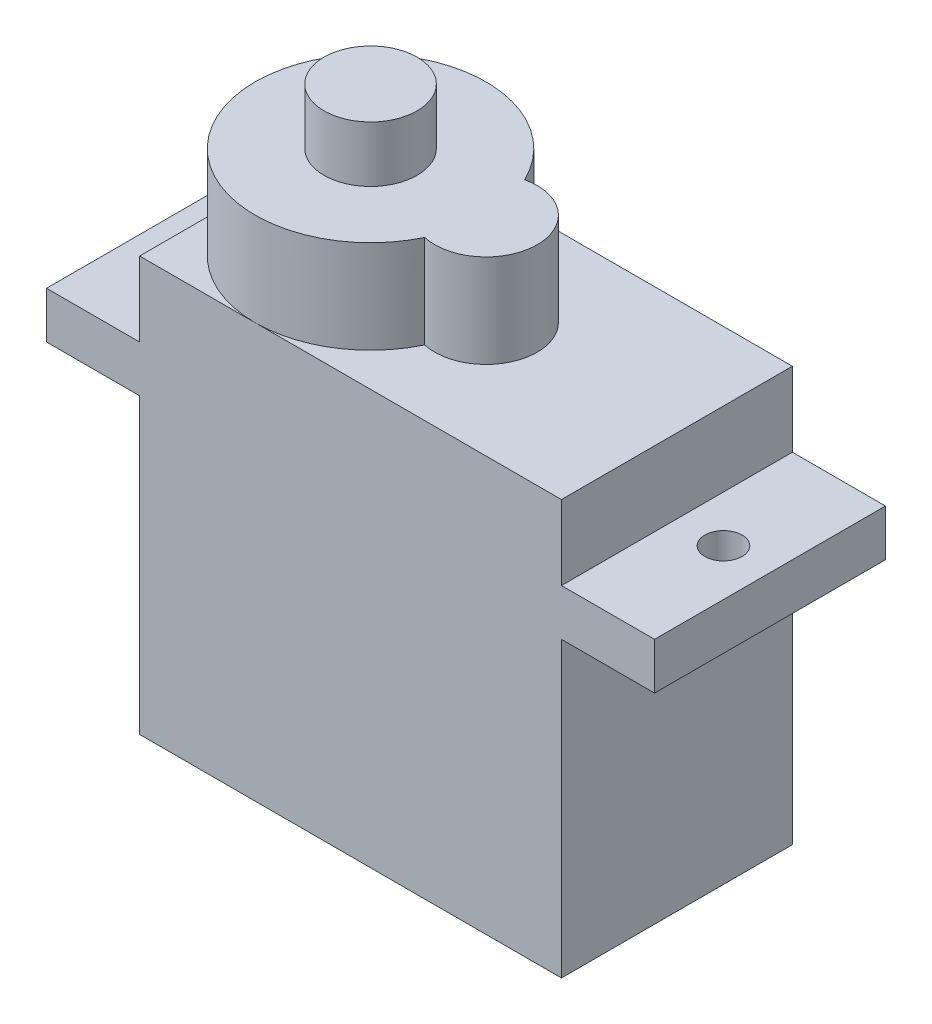
ISO-10303-21;
HEADER;
FILE_DESCRIPTION(('STEP AP214'),'2;1');
FILE_NAME('part.step','',(''),(''),'','','');
FILE_SCHEMA(('AUTOMOTIVE_DESIGN { 1 0 10303 214 1 1 1 1 }'));
ENDSEC;
DATA;
#1=APPLICATION_CONTEXT('core data for automotive mechanical design processes');
#2=APPLICATION_PROTOCOL_DEFINITION('international standard','automotive_design',2000,#1);
#3=PRODUCT_CONTEXT('',#1,'mechanical');
#4=PRODUCT('Part','Part','',(#3));
#5=PRODUCT_RELATED_PRODUCT_CATEGORY('part','',(#4));
#6=PRODUCT_DEFINITION_FORMATION('','',#4);
#7=PRODUCT_DEFINITION_CONTEXT('part definition',#1,'design');
#8=PRODUCT_DEFINITION('design','',#6,#7);
#9=PRODUCT_DEFINITION_SHAPE('','',#8);
#10=(LENGTH_UNIT() NAMED_UNIT(*) SI_UNIT(.MILLI.,.METRE.));
#11=(NAMED_UNIT(*) PLANE_ANGLE_UNIT() SI_UNIT($,.RADIAN.));
#12=(NAMED_UNIT(*) SI_UNIT($,.STERADIAN.) SOLID_ANGLE_UNIT());
#13=UNCERTAINTY_MEASURE_WITH_UNIT(LENGTH_MEASURE(1.E-05),#10,'distance_accuracy_value','');
#14=(GEOMETRIC_REPRESENTATION_CONTEXT(3) GLOBAL_UNCERTAINTY_ASSIGNED_CONTEXT((#13)) GLOBAL_UNIT_ASSIGNED_CONTEXT((#10,
#11,#12)) REPRESENTATION_CONTEXT('',''));
#15=CARTESIAN_POINT('',(0.,0.,0.));
#16=DIRECTION('',(0.,0.,1.));
#17=DIRECTION('',(1.,0.,0.));
#18=AXIS2_PLACEMENT_3D('',#15,#16,#17);
#19=CARTESIAN_POINT('',(-22.65,0.,12.4));
#20=DIRECTION('',(1.,0.,0.));
#21=DIRECTION('',(0.,0.,-1.));
#22=AXIS2_PLACEMENT_3D('',#19,#20,#21);
#23=PLANE('',#22);
#24=DIRECTION('',(0.,-1.,0.));
#25=VECTOR('',#24,1.);
#26=CARTESIAN_POINT('',(-22.65,0.,0.));
#27=LINE('',#26,#25);
#28=CARTESIAN_POINT('',(-22.65,15.75,0.));
#29=VERTEX_POINT('',#28);
#30=CARTESIAN_POINT('',(-22.65,0.,0.));
#31=VERTEX_POINT('',#30);
#32=EDGE_CURVE('E270',#29,#31,#27,.T.);
#33=ORIENTED_EDGE('',*,*,#32,.T.);
#34=DIRECTION('',(0.,0.,-1.));
#35=VECTOR('',#34,1.);
#36=CARTESIAN_POINT('',(-22.65,0.,12.4));
#37=LINE('',#36,#35);
#38=CARTESIAN_POINT('',(-22.65,0.,12.4));
#39=VERTEX_POINT('',#38);
#40=EDGE_CURVE('E275',#39,#31,#37,.T.);
#41=ORIENTED_EDGE('',*,*,#40,.F.);
#42=DIRECTION('',(0.,-1.,0.));
#43=VECTOR('',#42,1.);
#44=CARTESIAN_POINT('',(-22.65,0.,12.4));
#45=LINE('',#44,#43);
#46=CARTESIAN_POINT('',(-22.65,15.75,12.4));
#47=VERTEX_POINT('',#46);
#48=EDGE_CURVE('E243',#47,#39,#45,.T.);
#49=ORIENTED_EDGE('',*,*,#48,.F.);
#50=DIRECTION('',(0.,0.,-1.));
#51=VECTOR('',#50,1.);
#52=CARTESIAN_POINT('',(-22.65,15.75,12.4));
#53=LINE('',#52,#51);
#54=EDGE_CURVE('E278',#47,#29,#53,.T.);
#55=ORIENTED_EDGE('',*,*,#54,.T.);
#56=EDGE_LOOP('',(#33,#41,#49,#55));
#57=FACE_BOUND('',#56,.T.);
#58=DIRECTION('',(0.,-1.,0.));
#59=VECTOR('',#58,1.);
#60=CARTESIAN_POINT('',(-22.65,5.5,4.2));
#61=LINE('',#60,#59);
#62=CARTESIAN_POINT('',(-22.65,5.5,4.2));
#63=VERTEX_POINT('',#62);
#64=CARTESIAN_POINT('',(-22.65,4.5,4.2));
#65=VERTEX_POINT('',#64);
#66=EDGE_CURVE('E190',#63,#65,#61,.T.);
#67=ORIENTED_EDGE('',*,*,#66,.F.);
#68=DIRECTION('',(0.,0.,-1.));
#69=VECTOR('',#68,1.);
#70=CARTESIAN_POINT('',(-22.65,5.5,4.2));
#71=LINE('',#70,#69);
#72=CARTESIAN_POINT('',(-22.65,5.5,8.2));
#73=VERTEX_POINT('',#72);
#74=EDGE_CURVE('E187',#73,#63,#71,.T.);
#75=ORIENTED_EDGE('',*,*,#74,.F.);
#76=DIRECTION('',(0.,1.,0.));
#77=VECTOR('',#76,1.);
#78=CARTESIAN_POINT('',(-22.65,5.5,8.2));
#79=LINE('',#78,#77);
#80=CARTESIAN_POINT('',(-22.65,4.5,8.2));
#81=VERTEX_POINT('',#80);
#82=EDGE_CURVE('E56',#81,#73,#79,.T.);
#83=ORIENTED_EDGE('',*,*,#82,.F.);
#84=DIRECTION('',(0.,0.,1.));
#85=VECTOR('',#84,1.);
#86=CARTESIAN_POINT('',(-22.65,4.5,4.2));
#87=LINE('',#86,#85);
#88=EDGE_CURVE('E51',#65,#81,#87,.T.);
#89=ORIENTED_EDGE('',*,*,#88,.F.);
#90=EDGE_LOOP('',(#67,#75,#83,#89));
#91=FACE_BOUND('',#90,.T.);
#92=ADVANCED_FACE('F33',(#57,#91),#23,.F.);
#93=CARTESIAN_POINT('',(0.,22.25,12.4));
#94=DIRECTION('',(0.,-1.,0.));
#95=DIRECTION('',(1.,0.,0.));
#96=AXIS2_PLACEMENT_3D('',#93,#94,#95);
#97=PLANE('',#96);
#98=CARTESIAN_POINT('',(-10.25,22.25,6.2));
#99=DIRECTION('',(0.,1.,0.));
#100=DIRECTION('',(-1.,0.,0.));
#101=AXIS2_PLACEMENT_3D('',#98,#99,#100);
#102=CIRCLE('',#101,2.75);
#103=CARTESIAN_POINT('',(-10.8598790322581,22.25,8.88151963744664));
#104=VERTEX_POINT('',#103);
#105=CARTESIAN_POINT('',(-10.8598790322581,22.25,3.51848036255336));
#106=VERTEX_POINT('',#105);
#107=EDGE_CURVE('E201',#104,#106,#102,.T.);
#108=ORIENTED_EDGE('',*,*,#107,.F.);
#109=CARTESIAN_POINT('',(-16.45,22.25,6.2));
#110=DIRECTION('',(0.,1.,0.));
#111=DIRECTION('',(-1.,0.,0.));
#112=AXIS2_PLACEMENT_3D('',#109,#110,#111);
#113=CIRCLE('',#112,6.2);
#114=CARTESIAN_POINT('',(-16.45,22.25,12.4));
#115=VERTEX_POINT('',#114);
#116=EDGE_CURVE('E212',#115,#104,#113,.T.);
#117=ORIENTED_EDGE('',*,*,#116,.F.);
#118=DIRECTION('',(-1.,0.,0.));
#119=VECTOR('',#118,1.);
#120=CARTESIAN_POINT('',(0.,22.25,12.4));
#121=LINE('',#120,#119);
#122=CARTESIAN_POINT('',(0.,22.25,12.4));
#123=VERTEX_POINT('',#122);
#124=EDGE_CURVE('E232',#123,#115,#121,.T.);
#125=ORIENTED_EDGE('',*,*,#124,.F.);
#126=DIRECTION('',(0.,0.,-1.));
#127=VECTOR('',#126,1.);
#128=CARTESIAN_POINT('',(0.,22.25,12.4));
#129=LINE('',#128,#127);
#130=CARTESIAN_POINT('',(0.,22.25,0.));
#131=VERTEX_POINT('',#130);
#132=EDGE_CURVE('E294',#123,#131,#129,.T.);
#133=ORIENTED_EDGE('',*,*,#132,.T.);
#134=DIRECTION('',(-1.,0.,0.));
#135=VECTOR('',#134,1.);
#136=CARTESIAN_POINT('',(0.,22.25,0.));
#137=LINE('',#136,#135);
#138=CARTESIAN_POINT('',(-16.45,22.25,0.));
#139=VERTEX_POINT('',#138);
#140=EDGE_CURVE('E259',#131,#139,#137,.T.);
#141=ORIENTED_EDGE('',*,*,#140,.T.);
#142=EDGE_CURVE('E44',#106,#139,#113,.T.);
#143=ORIENTED_EDGE('',*,*,#142,.F.);
#144=EDGE_LOOP('',(#108,#117,#125,#133,#141,#143));
#145=FACE_BOUND('',#144,.T.);
#146=ADVANCED_FACE('F338',(#145),#97,.F.);
#147=CARTESIAN_POINT('',(-22.65,22.25,6.2));
#148=VERTEX_POINT('',#147);
#149=EDGE_CURVE('E11',#139,#148,#113,.T.);
#150=ORIENTED_EDGE('',*,*,#149,.F.);
#151=CARTESIAN_POINT('',(-22.65,22.25,0.));
#152=VERTEX_POINT('',#151);
#153=EDGE_CURVE('E258',#139,#152,#137,.T.);
#154=ORIENTED_EDGE('',*,*,#153,.T.);
#155=DIRECTION('',(0.,0.,-1.));
#156=VECTOR('',#155,1.);
#157=CARTESIAN_POINT('',(-22.65,22.25,12.4));
#158=LINE('',#157,#156);
#159=EDGE_CURVE('E290',#148,#152,#158,.T.);
#160=ORIENTED_EDGE('',*,*,#159,.F.);
#161=EDGE_LOOP('',(#150,#154,#160));
#162=FACE_BOUND('',#161,.T.);
#163=ADVANCED_FACE('F324',(#162),#97,.F.);
#164=CARTESIAN_POINT('',(0.,0.,12.4));
#165=DIRECTION('',(-1.,0.,0.));
#166=DIRECTION('',(0.,0.,1.));
#167=AXIS2_PLACEMENT_3D('',#164,#165,#166);
#168=PLANE('',#167);
#169=DIRECTION('',(0.,1.,0.));
#170=VECTOR('',#169,1.);
#171=CARTESIAN_POINT('',(0.,0.,0.));
#172=LINE('',#171,#170);
#173=CARTESIAN_POINT('',(0.,0.,0.));
#174=VERTEX_POINT('',#173);
#175=CARTESIAN_POINT('',(0.,15.75,0.));
#176=VERTEX_POINT('',#175);
#177=EDGE_CURVE('E218',#174,#176,#172,.T.);
#178=ORIENTED_EDGE('',*,*,#177,.T.);
#179=DIRECTION('',(0.,0.,-1.));
#180=VECTOR('',#179,1.);
#181=CARTESIAN_POINT('',(0.,15.75,12.4));
#182=LINE('',#181,#180);
#183=CARTESIAN_POINT('',(0.,15.75,12.4));
#184=VERTEX_POINT('',#183);
#185=EDGE_CURVE('E37',#184,#176,#182,.T.);
#186=ORIENTED_EDGE('',*,*,#185,.F.);
#187=DIRECTION('',(0.,1.,0.));
#188=VECTOR('',#187,1.);
#189=CARTESIAN_POINT('',(0.,0.,12.4));
#190=LINE('',#189,#188);
#191=CARTESIAN_POINT('',(0.,0.,12.4));
#192=VERTEX_POINT('',#191);
#193=EDGE_CURVE('E219',#192,#184,#190,.T.);
#194=ORIENTED_EDGE('',*,*,#193,.F.);
#195=DIRECTION('',(0.,0.,-1.));
#196=VECTOR('',#195,1.);
#197=CARTESIAN_POINT('',(0.,0.,12.4));
#198=LINE('',#197,#196);
#199=EDGE_CURVE('E247',#192,#174,#198,.T.);
#200=ORIENTED_EDGE('',*,*,#199,.T.);
#201=EDGE_LOOP('',(#178,#186,#194,#200));
#202=FACE_BOUND('',#201,.T.);
#203=ADVANCED_FACE('F35',(#202),#168,.F.);
#204=CARTESIAN_POINT('',(0.,15.75,12.4));
#205=DIRECTION('',(0.,1.,0.));
#206=DIRECTION('',(0.,0.,1.));
#207=AXIS2_PLACEMENT_3D('',#204,#205,#206);
#208=PLANE('',#207);
#209=CARTESIAN_POINT('',(2.5,15.75,6.2));
#210=DIRECTION('',(0.,1.,0.));
#211=DIRECTION('',(0.,0.,1.));
#212=AXIS2_PLACEMENT_3D('',#209,#210,#211);
#213=CIRCLE('',#212,1.);
#214=CARTESIAN_POINT('',(2.5,15.75,7.2));
#215=VERTEX_POINT('',#214);
#216=EDGE_CURVE('E404',#215,#215,#213,.T.);
#217=ORIENTED_EDGE('',*,*,#216,.T.);
#218=EDGE_LOOP('',(#217));
#219=FACE_BOUND('',#218,.T.);
#220=DIRECTION('',(1.,0.,0.));
#221=VECTOR('',#220,1.);
#222=CARTESIAN_POINT('',(0.,15.75,0.));
#223=LINE('',#222,#221);
#224=CARTESIAN_POINT('',(5.,15.75,0.));
#225=VERTEX_POINT('',#224);
#226=EDGE_CURVE('E250',#176,#225,#223,.T.);
#227=ORIENTED_EDGE('',*,*,#226,.T.);
#228=DIRECTION('',(0.,0.,-1.));
#229=VECTOR('',#228,1.);
#230=CARTESIAN_POINT('',(5.,15.75,12.4));
#231=LINE('',#230,#229);
#232=CARTESIAN_POINT('',(5.,15.75,12.4));
#233=VERTEX_POINT('',#232);
#234=EDGE_CURVE('E302',#233,#225,#231,.T.);
#235=ORIENTED_EDGE('',*,*,#234,.F.);
#236=DIRECTION('',(1.,0.,0.));
#237=VECTOR('',#236,1.);
#238=CARTESIAN_POINT('',(0.,15.75,12.4));
#239=LINE('',#238,#237);
#240=EDGE_CURVE('E222',#184,#233,#239,.T.);
#241=ORIENTED_EDGE('',*,*,#240,.F.);
#242=ORIENTED_EDGE('',*,*,#185,.T.);
#243=EDGE_LOOP('',(#227,#235,#241,#242));
#244=FACE_BOUND('',#243,.T.);
#245=ADVANCED_FACE('F395',(#219,#244),#208,.F.);
#246=CARTESIAN_POINT('',(5.,18.25,12.4));
#247=DIRECTION('',(-1.,0.,0.));
#248=DIRECTION('',(0.,0.,1.));
#249=AXIS2_PLACEMENT_3D('',#246,#247,#248);
#250=PLANE('',#249);
#251=DIRECTION('',(0.,1.,0.));
#252=VECTOR('',#251,1.);
#253=CARTESIAN_POINT('',(5.,18.25,0.));
#254=LINE('',#253,#252);
#255=CARTESIAN_POINT('',(5.,18.25,0.));
#256=VERTEX_POINT('',#255);
#257=EDGE_CURVE('E252',#225,#256,#254,.T.);
#258=ORIENTED_EDGE('',*,*,#257,.T.);
#259=DIRECTION('',(0.,0.,-1.));
#260=VECTOR('',#259,1.);
#261=CARTESIAN_POINT('',(5.,18.25,12.4));
#262=LINE('',#261,#260);
#263=CARTESIAN_POINT('',(5.,18.25,12.4));
#264=VERTEX_POINT('',#263);
#265=EDGE_CURVE('E300',#264,#256,#262,.T.);
#266=ORIENTED_EDGE('',*,*,#265,.F.);
#267=DIRECTION('',(0.,1.,0.));
#268=VECTOR('',#267,1.);
#269=CARTESIAN_POINT('',(5.,18.25,12.4));
#270=LINE('',#269,#268);
#271=EDGE_CURVE('E225',#233,#264,#270,.T.);
#272=ORIENTED_EDGE('',*,*,#271,.F.);
#273=ORIENTED_EDGE('',*,*,#234,.T.);
#274=EDGE_LOOP('',(#258,#266,#272,#273));
#275=FACE_BOUND('',#274,.T.);
#276=ADVANCED_FACE('F392',(#275),#250,.F.);
#277=CARTESIAN_POINT('',(0.,18.25,12.4));
#278=DIRECTION('',(0.,-1.,0.));
#279=DIRECTION('',(0.,0.,-1.));
#280=AXIS2_PLACEMENT_3D('',#277,#278,#279);
#281=PLANE('',#280);
#282=CARTESIAN_POINT('',(2.5,18.25,6.2));
#283=DIRECTION('',(0.,1.,0.));
#284=DIRECTION('',(0.,0.,1.));
#285=AXIS2_PLACEMENT_3D('',#282,#283,#284);
#286=CIRCLE('',#285,1.);
#287=CARTESIAN_POINT('',(2.5,18.25,7.2));
#288=VERTEX_POINT('',#287);
#289=EDGE_CURVE('E571',#288,#288,#286,.T.);
#290=ORIENTED_EDGE('',*,*,#289,.F.);
#291=EDGE_LOOP('',(#290));
#292=FACE_BOUND('',#291,.T.);
#293=DIRECTION('',(-1.,0.,0.));
#294=VECTOR('',#293,1.);
#295=CARTESIAN_POINT('',(0.,18.25,0.));
#296=LINE('',#295,#294);
#297=CARTESIAN_POINT('',(0.,18.25,0.));
#298=VERTEX_POINT('',#297);
#299=EDGE_CURVE('E254',#256,#298,#296,.T.);
#300=ORIENTED_EDGE('',*,*,#299,.T.);
#301=DIRECTION('',(0.,0.,-1.));
#302=VECTOR('',#301,1.);
#303=CARTESIAN_POINT('',(0.,18.25,12.4));
#304=LINE('',#303,#302);
#305=CARTESIAN_POINT('',(0.,18.25,12.4));
#306=VERTEX_POINT('',#305);
#307=EDGE_CURVE('E297',#306,#298,#304,.T.);
#308=ORIENTED_EDGE('',*,*,#307,.F.);
#309=DIRECTION('',(-1.,0.,0.));
#310=VECTOR('',#309,1.);
#311=CARTESIAN_POINT('',(0.,18.25,12.4));
#312=LINE('',#311,#310);
#313=EDGE_CURVE('E227',#264,#306,#312,.T.);
#314=ORIENTED_EDGE('',*,*,#313,.F.);
#315=ORIENTED_EDGE('',*,*,#265,.T.);
#316=EDGE_LOOP('',(#300,#308,#314,#315));
#317=FACE_BOUND('',#316,.T.);
#318=ADVANCED_FACE('F388',(#292,#317),#281,.F.);
#319=CARTESIAN_POINT('',(0.,18.25,12.4));
#320=DIRECTION('',(-1.,0.,0.));
#321=DIRECTION('',(0.,0.,1.));
#322=AXIS2_PLACEMENT_3D('',#319,#320,#321);
#323=PLANE('',#322);
#324=DIRECTION('',(0.,1.,0.));
#325=VECTOR('',#324,1.);
#326=CARTESIAN_POINT('',(0.,18.25,0.));
#327=LINE('',#326,#325);
#328=EDGE_CURVE('E256',#298,#131,#327,.T.);
#329=ORIENTED_EDGE('',*,*,#328,.T.);
#330=ORIENTED_EDGE('',*,*,#132,.F.);
#331=DIRECTION('',(0.,1.,0.));
#332=VECTOR('',#331,1.);
#333=CARTESIAN_POINT('',(0.,18.25,12.4));
#334=LINE('',#333,#332);
#335=EDGE_CURVE('E229',#306,#123,#334,.T.);
#336=ORIENTED_EDGE('',*,*,#335,.F.);
#337=ORIENTED_EDGE('',*,*,#307,.T.);
#338=EDGE_LOOP('',(#329,#330,#336,#337));
#339=FACE_BOUND('',#338,.T.);
#340=ADVANCED_FACE('F385',(#339),#323,.F.);
#341=EDGE_CURVE('E42',#148,#115,#113,.T.);
#342=ORIENTED_EDGE('',*,*,#341,.F.);
#343=CARTESIAN_POINT('',(-22.65,22.25,12.4));
#344=VERTEX_POINT('',#343);
#345=EDGE_CURVE('E291',#344,#148,#158,.T.);
#346=ORIENTED_EDGE('',*,*,#345,.F.);
#347=EDGE_CURVE('E231',#115,#344,#121,.T.);
#348=ORIENTED_EDGE('',*,*,#347,.F.);
#349=EDGE_LOOP('',(#342,#346,#348));
#350=FACE_BOUND('',#349,.T.);
#351=ADVANCED_FACE('F320',(#350),#97,.F.);
#352=CARTESIAN_POINT('',(-22.65,18.25,12.4));
#353=DIRECTION('',(1.,0.,0.));
#354=DIRECTION('',(0.,0.,-1.));
#355=AXIS2_PLACEMENT_3D('',#352,#353,#354);
#356=PLANE('',#355);
#357=DIRECTION('',(0.,-1.,0.));
#358=VECTOR('',#357,1.);
#359=CARTESIAN_POINT('',(-22.65,18.25,0.));
#360=LINE('',#359,#358);
#361=CARTESIAN_POINT('',(-22.65,18.25,0.));
#362=VERTEX_POINT('',#361);
#363=EDGE_CURVE('E262',#152,#362,#360,.T.);
#364=ORIENTED_EDGE('',*,*,#363,.T.);
#365=DIRECTION('',(0.,0.,-1.));
#366=VECTOR('',#365,1.);
#367=CARTESIAN_POINT('',(-22.65,18.25,12.4));
#368=LINE('',#367,#366);
#369=CARTESIAN_POINT('',(-22.65,18.25,12.4));
#370=VERTEX_POINT('',#369);
#371=EDGE_CURVE('E287',#370,#362,#368,.T.);
#372=ORIENTED_EDGE('',*,*,#371,.F.);
#373=DIRECTION('',(0.,-1.,0.));
#374=VECTOR('',#373,1.);
#375=CARTESIAN_POINT('',(-22.65,18.25,12.4));
#376=LINE('',#375,#374);
#377=EDGE_CURVE('E235',#344,#370,#376,.T.);
#378=ORIENTED_EDGE('',*,*,#377,.F.);
#379=ORIENTED_EDGE('',*,*,#345,.T.);
#380=ORIENTED_EDGE('',*,*,#159,.T.);
#381=EDGE_LOOP('',(#364,#372,#378,#379,#380));
#382=FACE_BOUND('',#381,.T.);
#383=ADVANCED_FACE('F328',(#382),#356,.F.);
#384=CARTESIAN_POINT('',(-22.65,18.25,12.4));
#385=DIRECTION('',(0.,-1.,0.));
#386=DIRECTION('',(0.,0.,-1.));
#387=AXIS2_PLACEMENT_3D('',#384,#385,#386);
#388=PLANE('',#387);
#389=CARTESIAN_POINT('',(-25.15,18.25,6.2));
#390=DIRECTION('',(0.,1.,0.));
#391=DIRECTION('',(0.,0.,1.));
#392=AXIS2_PLACEMENT_3D('',#389,#390,#391);
#393=CIRCLE('',#392,1.);
#394=CARTESIAN_POINT('',(-25.15,18.25,7.2));
#395=VERTEX_POINT('',#394);
#396=EDGE_CURVE('E576',#395,#395,#393,.T.);
#397=ORIENTED_EDGE('',*,*,#396,.F.);
#398=EDGE_LOOP('',(#397));
#399=FACE_BOUND('',#398,.T.);
#400=DIRECTION('',(-1.,0.,0.));
#401=VECTOR('',#400,1.);
#402=CARTESIAN_POINT('',(-22.65,18.25,0.));
#403=LINE('',#402,#401);
#404=CARTESIAN_POINT('',(-27.65,18.25,0.));
#405=VERTEX_POINT('',#404);
#406=EDGE_CURVE('E264',#362,#405,#403,.T.);
#407=ORIENTED_EDGE('',*,*,#406,.T.);
#408=DIRECTION('',(0.,0.,-1.));
#409=VECTOR('',#408,1.);
#410=CARTESIAN_POINT('',(-27.65,18.25,12.4));
#411=LINE('',#410,#409);
#412=CARTESIAN_POINT('',(-27.65,18.25,12.4));
#413=VERTEX_POINT('',#412);
#414=EDGE_CURVE('E284',#413,#405,#411,.T.);
#415=ORIENTED_EDGE('',*,*,#414,.F.);
#416=DIRECTION('',(-1.,0.,0.));
#417=VECTOR('',#416,1.);
#418=CARTESIAN_POINT('',(-22.65,18.25,12.4));
#419=LINE('',#418,#417);
#420=EDGE_CURVE('E237',#370,#413,#419,.T.);
#421=ORIENTED_EDGE('',*,*,#420,.F.);
#422=ORIENTED_EDGE('',*,*,#371,.T.);
#423=EDGE_LOOP('',(#407,#415,#421,#422));
#424=FACE_BOUND('',#423,.T.);
#425=ADVANCED_FACE('F377',(#399,#424),#388,.F.);
#426=CARTESIAN_POINT('',(-27.65,18.25,12.4));
#427=DIRECTION('',(1.,0.,0.));
#428=DIRECTION('',(0.,0.,-1.));
#429=AXIS2_PLACEMENT_3D('',#426,#427,#428);
#430=PLANE('',#429);
#431=DIRECTION('',(0.,-1.,0.));
#432=VECTOR('',#431,1.);
#433=CARTESIAN_POINT('',(-27.65,18.25,0.));
#434=LINE('',#433,#432);
#435=CARTESIAN_POINT('',(-27.65,15.75,0.));
#436=VERTEX_POINT('',#435);
#437=EDGE_CURVE('E266',#405,#436,#434,.T.);
#438=ORIENTED_EDGE('',*,*,#437,.T.);
#439=DIRECTION('',(0.,0.,-1.));
#440=VECTOR('',#439,1.);
#441=CARTESIAN_POINT('',(-27.65,15.75,12.4));
#442=LINE('',#441,#440);
#443=CARTESIAN_POINT('',(-27.65,15.75,12.4));
#444=VERTEX_POINT('',#443);
#445=EDGE_CURVE('E281',#444,#436,#442,.T.);
#446=ORIENTED_EDGE('',*,*,#445,.F.);
#447=DIRECTION('',(0.,-1.,0.));
#448=VECTOR('',#447,1.);
#449=CARTESIAN_POINT('',(-27.65,18.25,12.4));
#450=LINE('',#449,#448);
#451=EDGE_CURVE('E239',#413,#444,#450,.T.);
#452=ORIENTED_EDGE('',*,*,#451,.F.);
#453=ORIENTED_EDGE('',*,*,#414,.T.);
#454=EDGE_LOOP('',(#438,#446,#452,#453));
#455=FACE_BOUND('',#454,.T.);
#456=ADVANCED_FACE('F373',(#455),#430,.F.);
#457=CARTESIAN_POINT('',(-22.65,15.75,12.4));
#458=DIRECTION('',(0.,1.,0.));
#459=DIRECTION('',(0.,0.,1.));
#460=AXIS2_PLACEMENT_3D('',#457,#458,#459);
#461=PLANE('',#460);
#462=CARTESIAN_POINT('',(-25.15,15.75,6.2));
#463=DIRECTION('',(0.,1.,0.));
#464=DIRECTION('',(0.,0.,1.));
#465=AXIS2_PLACEMENT_3D('',#462,#463,#464);
#466=CIRCLE('',#465,1.);
#467=CARTESIAN_POINT('',(-25.15,15.75,7.2));
#468=VERTEX_POINT('',#467);
#469=EDGE_CURVE('E572',#468,#468,#466,.T.);
#470=ORIENTED_EDGE('',*,*,#469,.T.);
#471=EDGE_LOOP('',(#470));
#472=FACE_BOUND('',#471,.T.);
#473=DIRECTION('',(1.,0.,0.));
#474=VECTOR('',#473,1.);
#475=CARTESIAN_POINT('',(-22.65,15.75,0.));
#476=LINE('',#475,#474);
#477=EDGE_CURVE('E268',#436,#29,#476,.T.);
#478=ORIENTED_EDGE('',*,*,#477,.T.);
#479=ORIENTED_EDGE('',*,*,#54,.F.);
#480=DIRECTION('',(1.,0.,0.));
#481=VECTOR('',#480,1.);
#482=CARTESIAN_POINT('',(-22.65,15.75,12.4));
#483=LINE('',#482,#481);
#484=EDGE_CURVE('E241',#444,#47,#483,.T.);
#485=ORIENTED_EDGE('',*,*,#484,.F.);
#486=ORIENTED_EDGE('',*,*,#445,.T.);
#487=EDGE_LOOP('',(#478,#479,#485,#486));
#488=FACE_BOUND('',#487,.T.);
#489=ADVANCED_FACE('F370',(#472,#488),#461,.F.);
#490=CARTESIAN_POINT('',(0.,0.,12.4));
#491=DIRECTION('',(0.,1.,0.));
#492=DIRECTION('',(-1.,0.,0.));
#493=AXIS2_PLACEMENT_3D('',#490,#491,#492);
#494=PLANE('',#493);
#495=DIRECTION('',(1.,0.,0.));
#496=VECTOR('',#495,1.);
#497=CARTESIAN_POINT('',(0.,0.,0.));
#498=LINE('',#497,#496);
#499=EDGE_CURVE('E223',#31,#174,#498,.T.);
#500=ORIENTED_EDGE('',*,*,#499,.T.);
#501=ORIENTED_EDGE('',*,*,#199,.F.);
#502=DIRECTION('',(1.,0.,0.));
#503=VECTOR('',#502,1.);
#504=CARTESIAN_POINT('',(0.,0.,12.4));
#505=LINE('',#504,#503);
#506=EDGE_CURVE('E245',#39,#192,#505,.T.);
#507=ORIENTED_EDGE('',*,*,#506,.F.);
#508=ORIENTED_EDGE('',*,*,#40,.T.);
#509=EDGE_LOOP('',(#500,#501,#507,#508));
#510=FACE_BOUND('',#509,.T.);
#511=ADVANCED_FACE('F368',(#510),#494,.F.);
#512=CARTESIAN_POINT('',(0.,0.,12.4));
#513=DIRECTION('',(0.,0.,-1.));
#514=DIRECTION('',(-1.,0.,0.));
#515=AXIS2_PLACEMENT_3D('',#512,#513,#514);
#516=PLANE('',#515);
#517=ORIENTED_EDGE('',*,*,#193,.T.);
#518=ORIENTED_EDGE('',*,*,#240,.T.);
#519=ORIENTED_EDGE('',*,*,#271,.T.);
#520=ORIENTED_EDGE('',*,*,#313,.T.);
#521=ORIENTED_EDGE('',*,*,#335,.T.);
#522=ORIENTED_EDGE('',*,*,#124,.T.);
#523=ORIENTED_EDGE('',*,*,#347,.T.);
#524=ORIENTED_EDGE('',*,*,#377,.T.);
#525=ORIENTED_EDGE('',*,*,#420,.T.);
#526=ORIENTED_EDGE('',*,*,#451,.T.);
#527=ORIENTED_EDGE('',*,*,#484,.T.);
#528=ORIENTED_EDGE('',*,*,#48,.T.);
#529=ORIENTED_EDGE('',*,*,#506,.T.);
#530=EDGE_LOOP('',(#517,#518,#519,#520,#521,#522,#523,#524,#525,#526,#527,#528,#529));
#531=FACE_BOUND('',#530,.T.);
#532=ADVANCED_FACE('F332',(#531),#516,.F.);
#533=CARTESIAN_POINT('',(0.,0.,0.));
#534=DIRECTION('',(0.,0.,-1.));
#535=DIRECTION('',(-1.,0.,0.));
#536=AXIS2_PLACEMENT_3D('',#533,#534,#535);
#537=PLANE('',#536);
#538=ORIENTED_EDGE('',*,*,#177,.F.);
#539=ORIENTED_EDGE('',*,*,#499,.F.);
#540=ORIENTED_EDGE('',*,*,#32,.F.);
#541=ORIENTED_EDGE('',*,*,#477,.F.);
#542=ORIENTED_EDGE('',*,*,#437,.F.);
#543=ORIENTED_EDGE('',*,*,#406,.F.);
#544=ORIENTED_EDGE('',*,*,#363,.F.);
#545=ORIENTED_EDGE('',*,*,#153,.F.);
#546=ORIENTED_EDGE('',*,*,#140,.F.);
#547=ORIENTED_EDGE('',*,*,#328,.F.);
#548=ORIENTED_EDGE('',*,*,#299,.F.);
#549=ORIENTED_EDGE('',*,*,#257,.F.);
#550=ORIENTED_EDGE('',*,*,#226,.F.);
#551=EDGE_LOOP('',(#538,#539,#540,#541,#542,#543,#544,#545,#546,#547,#548,#549,#550));
#552=FACE_BOUND('',#551,.T.);
#553=ADVANCED_FACE('F407',(#552),#537,.T.);
#554=CARTESIAN_POINT('',(-10.25,27.25,6.2));
#555=DIRECTION('',(0.,-1.,0.));
#556=DIRECTION('',(1.,0.,0.));
#557=AXIS2_PLACEMENT_3D('',#554,#555,#556);
#558=CYLINDRICAL_SURFACE('',#557,2.75);
#559=ORIENTED_EDGE('',*,*,#107,.T.);
#560=DIRECTION('',(0.,-1.,0.));
#561=VECTOR('',#560,1.);
#562=CARTESIAN_POINT('',(-10.8598790322581,27.25,3.51848036255336));
#563=LINE('',#562,#561);
#564=CARTESIAN_POINT('',(-10.8598790322581,27.25,3.51848036255336));
#565=VERTEX_POINT('',#564);
#566=EDGE_CURVE('E215',#565,#106,#563,.T.);
#567=ORIENTED_EDGE('',*,*,#566,.F.);
#568=CARTESIAN_POINT('',(-10.25,27.25,6.2));
#569=DIRECTION('',(0.,1.,0.));
#570=DIRECTION('',(-1.,0.,0.));
#571=AXIS2_PLACEMENT_3D('',#568,#569,#570);
#572=CIRCLE('',#571,2.75);
#573=CARTESIAN_POINT('',(-10.8598790322581,27.25,8.88151963744664));
#574=VERTEX_POINT('',#573);
#575=EDGE_CURVE('E203',#574,#565,#572,.T.);
#576=ORIENTED_EDGE('',*,*,#575,.F.);
#577=DIRECTION('',(0.,-1.,0.));
#578=VECTOR('',#577,1.);
#579=CARTESIAN_POINT('',(-10.8598790322581,27.25,8.88151963744664));
#580=LINE('',#579,#578);
#581=EDGE_CURVE('E208',#574,#104,#580,.T.);
#582=ORIENTED_EDGE('',*,*,#581,.T.);
#583=EDGE_LOOP('',(#559,#567,#576,#582));
#584=FACE_BOUND('',#583,.T.);
#585=ADVANCED_FACE('F342',(#584),#558,.T.);
#586=CARTESIAN_POINT('',(-16.45,27.25,6.2));
#587=DIRECTION('',(0.,-1.,0.));
#588=DIRECTION('',(1.,0.,0.));
#589=AXIS2_PLACEMENT_3D('',#586,#587,#588);
#590=CYLINDRICAL_SURFACE('',#589,6.2);
#591=ORIENTED_EDGE('',*,*,#142,.T.);
#592=ORIENTED_EDGE('',*,*,#149,.T.);
#593=ORIENTED_EDGE('',*,*,#341,.T.);
#594=ORIENTED_EDGE('',*,*,#116,.T.);
#595=ORIENTED_EDGE('',*,*,#581,.F.);
#596=CARTESIAN_POINT('',(-16.45,27.25,6.2));
#597=DIRECTION('',(0.,1.,0.));
#598=DIRECTION('',(-1.,0.,0.));
#599=AXIS2_PLACEMENT_3D('',#596,#597,#598);
#600=CIRCLE('',#599,6.2);
#601=EDGE_CURVE('E206',#565,#574,#600,.T.);
#602=ORIENTED_EDGE('',*,*,#601,.F.);
#603=ORIENTED_EDGE('',*,*,#566,.T.);
#604=EDGE_LOOP('',(#591,#592,#593,#594,#595,#602,#603));
#605=FACE_BOUND('',#604,.T.);
#606=ADVANCED_FACE('F315',(#605),#590,.T.);
#607=CARTESIAN_POINT('',(-13.35,27.25,6.2));
#608=DIRECTION('',(0.,1.,0.));
#609=DIRECTION('',(-1.,0.,0.));
#610=AXIS2_PLACEMENT_3D('',#607,#608,#609);
#611=PLANE('',#610);
#612=CARTESIAN_POINT('',(-16.45,27.25,6.2));
#613=DIRECTION('',(0.,1.,0.));
#614=DIRECTION('',(-1.,0.,0.));
#615=AXIS2_PLACEMENT_3D('',#612,#613,#614);
#616=CIRCLE('',#615,2.5);
#617=CARTESIAN_POINT('',(-18.95,27.25,6.2));
#618=VERTEX_POINT('',#617);
#619=EDGE_CURVE('E191',#618,#618,#616,.T.);
#620=ORIENTED_EDGE('',*,*,#619,.F.);
#621=EDGE_LOOP('',(#620));
#622=FACE_BOUND('',#621,.T.);
#623=ORIENTED_EDGE('',*,*,#575,.T.);
#624=ORIENTED_EDGE('',*,*,#601,.T.);
#625=EDGE_LOOP('',(#623,#624));
#626=FACE_BOUND('',#625,.T.);
#627=ADVANCED_FACE('F345',(#622,#626),#611,.T.);
#628=CARTESIAN_POINT('',(-16.45,30.25,6.2));
#629=DIRECTION('',(0.,-1.,0.));
#630=DIRECTION('',(1.,0.,0.));
#631=AXIS2_PLACEMENT_3D('',#628,#629,#630);
#632=CYLINDRICAL_SURFACE('',#631,2.5);
#633=CARTESIAN_POINT('',(-16.45,30.25,6.2));
#634=DIRECTION('',(0.,1.,0.));
#635=DIRECTION('',(-1.,0.,0.));
#636=AXIS2_PLACEMENT_3D('',#633,#634,#635);
#637=CIRCLE('',#636,2.5);
#638=CARTESIAN_POINT('',(-18.95,30.25,6.2));
#639=VERTEX_POINT('',#638);
#640=EDGE_CURVE('E194',#639,#639,#637,.T.);
#641=ORIENTED_EDGE('',*,*,#640,.F.);
#642=EDGE_LOOP('',(#641));
#643=FACE_BOUND('',#642,.T.);
#644=ORIENTED_EDGE('',*,*,#619,.T.);
#645=EDGE_LOOP('',(#644));
#646=FACE_BOUND('',#645,.T.);
#647=ADVANCED_FACE('F347',(#643,#646),#632,.T.);
#648=CARTESIAN_POINT('',(-16.45,30.25,6.2));
#649=DIRECTION('',(0.,1.,0.));
#650=DIRECTION('',(-1.,0.,0.));
#651=AXIS2_PLACEMENT_3D('',#648,#649,#650);
#652=PLANE('',#651);
#653=ORIENTED_EDGE('',*,*,#640,.T.);
#654=EDGE_LOOP('',(#653));
#655=FACE_BOUND('',#654,.T.);
#656=ADVANCED_FACE('F354',(#655),#652,.T.);
#657=CARTESIAN_POINT('',(-25.65,5.5,4.2));
#658=DIRECTION('',(0.,0.,1.));
#659=DIRECTION('',(0.,-1.,0.));
#660=AXIS2_PLACEMENT_3D('',#657,#658,#659);
#661=PLANE('',#660);
#662=ORIENTED_EDGE('',*,*,#66,.T.);
#663=DIRECTION('',(1.,0.,0.));
#664=VECTOR('',#663,1.);
#665=CARTESIAN_POINT('',(-25.65,4.5,4.2));
#666=LINE('',#665,#664);
#667=CARTESIAN_POINT('',(-25.65,4.5,4.2));
#668=VERTEX_POINT('',#667);
#669=EDGE_CURVE('E171',#668,#65,#666,.T.);
#670=ORIENTED_EDGE('',*,*,#669,.F.);
#671=DIRECTION('',(0.,-1.,0.));
#672=VECTOR('',#671,1.);
#673=CARTESIAN_POINT('',(-25.65,5.5,4.2));
#674=LINE('',#673,#672);
#675=CARTESIAN_POINT('',(-25.65,5.5,4.2));
#676=VERTEX_POINT('',#675);
#677=EDGE_CURVE('E178',#676,#668,#674,.T.);
#678=ORIENTED_EDGE('',*,*,#677,.F.);
#679=DIRECTION('',(1.,0.,0.));
#680=VECTOR('',#679,1.);
#681=CARTESIAN_POINT('',(-25.65,5.5,4.2));
#682=LINE('',#681,#680);
#683=EDGE_CURVE('E583',#676,#63,#682,.T.);
#684=ORIENTED_EDGE('',*,*,#683,.T.);
#685=EDGE_LOOP('',(#662,#670,#678,#684));
#686=FACE_BOUND('',#685,.T.);
#687=ADVANCED_FACE('F189',(#686),#661,.F.);
#688=CARTESIAN_POINT('',(-25.65,4.5,4.2));
#689=DIRECTION('',(0.,1.,0.));
#690=DIRECTION('',(0.,0.,1.));
#691=AXIS2_PLACEMENT_3D('',#688,#689,#690);
#692=PLANE('',#691);
#693=ORIENTED_EDGE('',*,*,#88,.T.);
#694=DIRECTION('',(1.,0.,0.));
#695=VECTOR('',#694,1.);
#696=CARTESIAN_POINT('',(-25.65,4.5,8.2));
#697=LINE('',#696,#695);
#698=CARTESIAN_POINT('',(-25.65,4.5,8.2));
#699=VERTEX_POINT('',#698);
#700=EDGE_CURVE('E174',#699,#81,#697,.T.);
#701=ORIENTED_EDGE('',*,*,#700,.F.);
#702=DIRECTION('',(0.,0.,1.));
#703=VECTOR('',#702,1.);
#704=CARTESIAN_POINT('',(-25.65,4.5,4.2));
#705=LINE('',#704,#703);
#706=EDGE_CURVE('E167',#668,#699,#705,.T.);
#707=ORIENTED_EDGE('',*,*,#706,.F.);
#708=ORIENTED_EDGE('',*,*,#669,.T.);
#709=EDGE_LOOP('',(#693,#701,#707,#708));
#710=FACE_BOUND('',#709,.T.);
#711=ADVANCED_FACE('F169',(#710),#692,.F.);
#712=CARTESIAN_POINT('',(-25.65,5.5,8.2));
#713=DIRECTION('',(0.,0.,-1.));
#714=DIRECTION('',(0.,1.,0.));
#715=AXIS2_PLACEMENT_3D('',#712,#713,#714);
#716=PLANE('',#715);
#717=ORIENTED_EDGE('',*,*,#82,.T.);
#718=DIRECTION('',(1.,0.,0.));
#719=VECTOR('',#718,1.);
#720=CARTESIAN_POINT('',(-25.65,5.5,8.2));
#721=LINE('',#720,#719);
#722=CARTESIAN_POINT('',(-25.65,5.5,8.2));
#723=VERTEX_POINT('',#722);
#724=EDGE_CURVE('E196',#723,#73,#721,.T.);
#725=ORIENTED_EDGE('',*,*,#724,.F.);
#726=DIRECTION('',(0.,1.,0.));
#727=VECTOR('',#726,1.);
#728=CARTESIAN_POINT('',(-25.65,5.5,8.2));
#729=LINE('',#728,#727);
#730=EDGE_CURVE('E177',#699,#723,#729,.T.);
#731=ORIENTED_EDGE('',*,*,#730,.F.);
#732=ORIENTED_EDGE('',*,*,#700,.T.);
#733=EDGE_LOOP('',(#717,#725,#731,#732));
#734=FACE_BOUND('',#733,.T.);
#735=ADVANCED_FACE('F489',(#734),#716,.F.);
#736=CARTESIAN_POINT('',(-25.65,5.5,4.2));
#737=DIRECTION('',(0.,-1.,0.));
#738=DIRECTION('',(0.,0.,-1.));
#739=AXIS2_PLACEMENT_3D('',#736,#737,#738);
#740=PLANE('',#739);
#741=ORIENTED_EDGE('',*,*,#74,.T.);
#742=ORIENTED_EDGE('',*,*,#683,.F.);
#743=DIRECTION('',(0.,0.,-1.));
#744=VECTOR('',#743,1.);
#745=CARTESIAN_POINT('',(-25.65,5.5,4.2));
#746=LINE('',#745,#744);
#747=EDGE_CURVE('E183',#723,#676,#746,.T.);
#748=ORIENTED_EDGE('',*,*,#747,.F.);
#749=ORIENTED_EDGE('',*,*,#724,.T.);
#750=EDGE_LOOP('',(#741,#742,#748,#749));
#751=FACE_BOUND('',#750,.T.);
#752=ADVANCED_FACE('F498',(#751),#740,.F.);
#753=CARTESIAN_POINT('',(-25.65,0.,0.));
#754=DIRECTION('',(-1.,0.,0.));
#755=DIRECTION('',(0.,0.,1.));
#756=AXIS2_PLACEMENT_3D('',#753,#754,#755);
#757=PLANE('',#756);
#758=ORIENTED_EDGE('',*,*,#677,.T.);
#759=ORIENTED_EDGE('',*,*,#706,.T.);
#760=ORIENTED_EDGE('',*,*,#730,.T.);
#761=ORIENTED_EDGE('',*,*,#747,.T.);
#762=EDGE_LOOP('',(#758,#759,#760,#761));
#763=FACE_BOUND('',#762,.T.);
#764=ADVANCED_FACE('F181',(#763),#757,.T.);
#765=CARTESIAN_POINT('',(-25.15,15.75,6.2));
#766=DIRECTION('',(0.,1.,0.));
#767=DIRECTION('',(0.,0.,1.));
#768=AXIS2_PLACEMENT_3D('',#765,#766,#767);
#769=CYLINDRICAL_SURFACE('',#768,1.);
#770=ORIENTED_EDGE('',*,*,#469,.F.);
#771=EDGE_LOOP('',(#770));
#772=FACE_BOUND('',#771,.T.);
#773=ORIENTED_EDGE('',*,*,#396,.T.);
#774=EDGE_LOOP('',(#773));
#775=FACE_BOUND('',#774,.T.);
#776=ADVANCED_FACE('F516',(#772,#775),#769,.F.);
#777=CARTESIAN_POINT('',(2.5,15.75,6.2));
#778=DIRECTION('',(0.,1.,0.));
#779=DIRECTION('',(0.,0.,1.));
#780=AXIS2_PLACEMENT_3D('',#777,#778,#779);
#781=CYLINDRICAL_SURFACE('',#780,1.);
#782=ORIENTED_EDGE('',*,*,#216,.F.);
#783=EDGE_LOOP('',(#782));
#784=FACE_BOUND('',#783,.T.);
#785=ORIENTED_EDGE('',*,*,#289,.T.);
#786=EDGE_LOOP('',(#785));
#787=FACE_BOUND('',#786,.T.);
#788=ADVANCED_FACE('F554',(#784,#787),#781,.F.);
#789=CLOSED_SHELL('',(#92,#146,#163,#203,#245,#276,#318,#340,#351,#383,#425,#456,#489,#511,#532,
#553,#585,#606,#627,#647,#656,#687,#711,#735,#752,#764,#776,#788));
#790=MANIFOLD_SOLID_BREP('B2',#789);
#791=ADVANCED_BREP_SHAPE_REPRESENTATION('',(#18,#790),#14);
#792=SHAPE_DEFINITION_REPRESENTATION(#9,#791);
ENDSEC;
END-ISO-10303-21;
